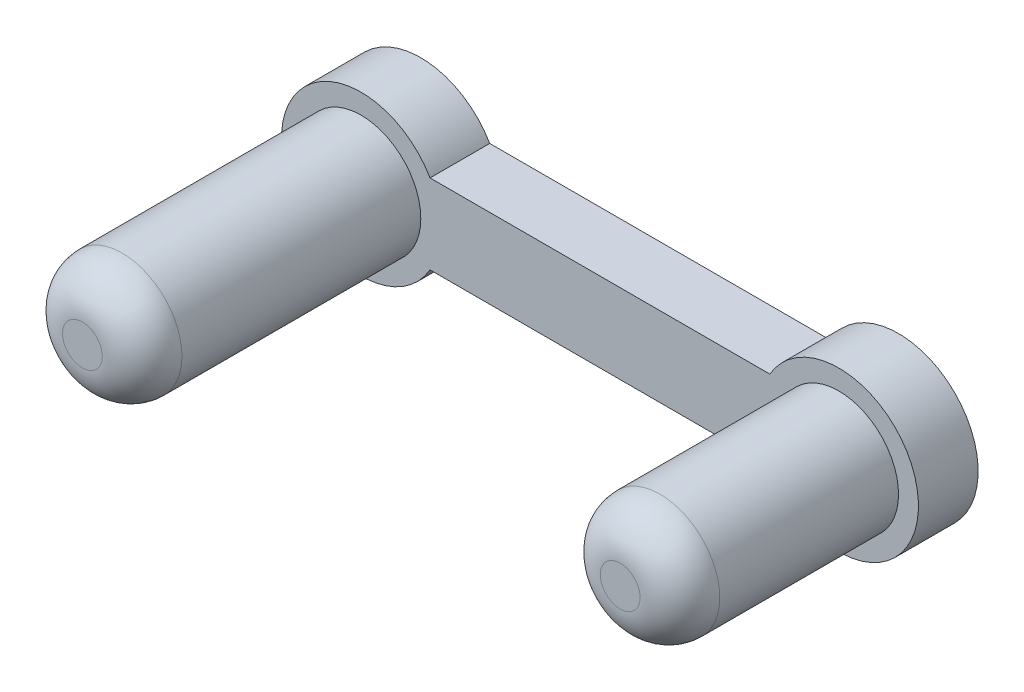
ISO-10303-21;
HEADER;
FILE_DESCRIPTION(('STEP AP214'),'2;1');
FILE_NAME('part.step','',(''),(''),'','','');
FILE_SCHEMA(('AUTOMOTIVE_DESIGN { 1 0 10303 214 1 1 1 1 }'));
ENDSEC;
DATA;
#1=APPLICATION_CONTEXT('core data for automotive mechanical design processes');
#2=APPLICATION_PROTOCOL_DEFINITION('international standard','automotive_design',2000,#1);
#3=PRODUCT_CONTEXT('',#1,'mechanical');
#4=PRODUCT('Part','Part','',(#3));
#5=PRODUCT_RELATED_PRODUCT_CATEGORY('part','',(#4));
#6=PRODUCT_DEFINITION_FORMATION('','',#4);
#7=PRODUCT_DEFINITION_CONTEXT('part definition',#1,'design');
#8=PRODUCT_DEFINITION('design','',#6,#7);
#9=PRODUCT_DEFINITION_SHAPE('','',#8);
#10=(LENGTH_UNIT() NAMED_UNIT(*) SI_UNIT(.MILLI.,.METRE.));
#11=(NAMED_UNIT(*) PLANE_ANGLE_UNIT() SI_UNIT($,.RADIAN.));
#12=(NAMED_UNIT(*) SI_UNIT($,.STERADIAN.) SOLID_ANGLE_UNIT());
#13=UNCERTAINTY_MEASURE_WITH_UNIT(LENGTH_MEASURE(1.E-05),#10,'distance_accuracy_value','');
#14=(GEOMETRIC_REPRESENTATION_CONTEXT(3) GLOBAL_UNCERTAINTY_ASSIGNED_CONTEXT((#13)) GLOBAL_UNIT_ASSIGNED_CONTEXT((#10,
#11,#12)) REPRESENTATION_CONTEXT('',''));
#15=CARTESIAN_POINT('',(0.,0.,0.));
#16=DIRECTION('',(0.,0.,1.));
#17=DIRECTION('',(1.,0.,0.));
#18=AXIS2_PLACEMENT_3D('',#15,#16,#17);
#19=CARTESIAN_POINT('',(60.,-40.,-31.6227766016838));
#20=DIRECTION('',(0.,1.,0.));
#21=DIRECTION('',(0.,0.,1.));
#22=AXIS2_PLACEMENT_3D('',#19,#20,#21);
#23=PLANE('',#22);
#24=DIRECTION('',(-1.,0.,0.));
#25=VECTOR('',#24,1.);
#26=CARTESIAN_POINT('',(60.,-40.,7.5));
#27=LINE('',#26,#25);
#28=CARTESIAN_POINT('',(96.3397459621556,-40.,7.5));
#29=VERTEX_POINT('',#28);
#30=CARTESIAN_POINT('',(53.6602540378444,-40.,7.5));
#31=VERTEX_POINT('',#30);
#32=EDGE_CURVE('E239',#29,#31,#27,.T.);
#33=ORIENTED_EDGE('',*,*,#32,.F.);
#34=DIRECTION('',(0.,0.,1.));
#35=VECTOR('',#34,1.);
#36=CARTESIAN_POINT('',(96.3397459621556,-40.,0.));
#37=LINE('',#36,#35);
#38=CARTESIAN_POINT('',(96.3397459621556,-40.,0.));
#39=VERTEX_POINT('',#38);
#40=EDGE_CURVE('E263',#39,#29,#37,.T.);
#41=ORIENTED_EDGE('',*,*,#40,.F.);
#42=DIRECTION('',(1.,0.,0.));
#43=VECTOR('',#42,1.);
#44=CARTESIAN_POINT('',(60.,-40.,0.));
#45=LINE('',#44,#43);
#46=CARTESIAN_POINT('',(53.6602540378444,-40.,0.));
#47=VERTEX_POINT('',#46);
#48=EDGE_CURVE('E259',#47,#39,#45,.T.);
#49=ORIENTED_EDGE('',*,*,#48,.F.);
#50=DIRECTION('',(0.,0.,1.));
#51=VECTOR('',#50,1.);
#52=CARTESIAN_POINT('',(53.6602540378444,-40.,0.));
#53=LINE('',#52,#51);
#54=EDGE_CURVE('E261',#47,#31,#53,.T.);
#55=ORIENTED_EDGE('',*,*,#54,.T.);
#56=EDGE_LOOP('',(#33,#41,#49,#55));
#57=FACE_BOUND('',#56,.T.);
#58=ADVANCED_FACE('F215',(#57),#23,.T.);
#59=CARTESIAN_POINT('',(60.,-50.,-31.6227766016838));
#60=DIRECTION('',(0.,-1.,0.));
#61=DIRECTION('',(0.,0.,-1.));
#62=AXIS2_PLACEMENT_3D('',#59,#60,#61);
#63=PLANE('',#62);
#64=DIRECTION('',(-1.,0.,0.));
#65=VECTOR('',#64,1.);
#66=CARTESIAN_POINT('',(60.,-50.,0.));
#67=LINE('',#66,#65);
#68=CARTESIAN_POINT('',(96.3397459621556,-50.,0.));
#69=VERTEX_POINT('',#68);
#70=CARTESIAN_POINT('',(53.6602540378444,-50.,0.));
#71=VERTEX_POINT('',#70);
#72=EDGE_CURVE('E269',#69,#71,#67,.T.);
#73=ORIENTED_EDGE('',*,*,#72,.F.);
#74=DIRECTION('',(0.,0.,1.));
#75=VECTOR('',#74,1.);
#76=CARTESIAN_POINT('',(96.3397459621556,-50.,0.));
#77=LINE('',#76,#75);
#78=CARTESIAN_POINT('',(96.3397459621556,-50.,7.5));
#79=VERTEX_POINT('',#78);
#80=EDGE_CURVE('E282',#69,#79,#77,.T.);
#81=ORIENTED_EDGE('',*,*,#80,.T.);
#82=DIRECTION('',(1.,0.,0.));
#83=VECTOR('',#82,1.);
#84=CARTESIAN_POINT('',(60.,-50.,7.5));
#85=LINE('',#84,#83);
#86=CARTESIAN_POINT('',(53.6602540378444,-50.,7.5));
#87=VERTEX_POINT('',#86);
#88=EDGE_CURVE('E231',#87,#79,#85,.T.);
#89=ORIENTED_EDGE('',*,*,#88,.F.);
#90=DIRECTION('',(0.,0.,1.));
#91=VECTOR('',#90,1.);
#92=CARTESIAN_POINT('',(53.6602540378444,-50.,0.));
#93=LINE('',#92,#91);
#94=EDGE_CURVE('E277',#71,#87,#93,.T.);
#95=ORIENTED_EDGE('',*,*,#94,.F.);
#96=EDGE_LOOP('',(#73,#81,#89,#95));
#97=FACE_BOUND('',#96,.T.);
#98=ADVANCED_FACE('F329',(#97),#63,.T.);
#99=CARTESIAN_POINT('',(0.,0.,7.5));
#100=DIRECTION('',(0.,0.,1.));
#101=DIRECTION('',(1.,0.,0.));
#102=AXIS2_PLACEMENT_3D('',#99,#100,#101);
#103=PLANE('',#102);
#104=CARTESIAN_POINT('',(45.,-45.,7.5));
#105=DIRECTION('',(0.,0.,1.));
#106=DIRECTION('',(1.,0.,0.));
#107=AXIS2_PLACEMENT_3D('',#104,#105,#106);
#108=CIRCLE('',#107,10.);
#109=EDGE_CURVE('E275',#31,#87,#108,.T.);
#110=ORIENTED_EDGE('',*,*,#109,.T.);
#111=ORIENTED_EDGE('',*,*,#88,.T.);
#112=CARTESIAN_POINT('',(105.,-45.,7.5));
#113=DIRECTION('',(0.,0.,1.));
#114=DIRECTION('',(1.,0.,0.));
#115=AXIS2_PLACEMENT_3D('',#112,#113,#114);
#116=CIRCLE('',#115,9.99999999999999);
#117=EDGE_CURVE('E286',#79,#29,#116,.T.);
#118=ORIENTED_EDGE('',*,*,#117,.T.);
#119=ORIENTED_EDGE('',*,*,#32,.T.);
#120=EDGE_LOOP('',(#110,#111,#118,#119));
#121=FACE_BOUND('',#120,.T.);
#122=CARTESIAN_POINT('',(45.,-45.,7.5));
#123=DIRECTION('',(0.,0.,1.));
#124=DIRECTION('',(1.,0.,0.));
#125=AXIS2_PLACEMENT_3D('',#122,#123,#124);
#126=CIRCLE('',#125,7.5);
#127=CARTESIAN_POINT('',(52.5,-45.,7.5));
#128=VERTEX_POINT('',#127);
#129=EDGE_CURVE('E219',#128,#128,#126,.T.);
#130=ORIENTED_EDGE('',*,*,#129,.F.);
#131=EDGE_LOOP('',(#130));
#132=FACE_BOUND('',#131,.T.);
#133=CARTESIAN_POINT('',(105.,-45.,7.5));
#134=DIRECTION('',(0.,0.,1.));
#135=DIRECTION('',(1.,0.,0.));
#136=AXIS2_PLACEMENT_3D('',#133,#134,#135);
#137=CIRCLE('',#136,7.50000000000001);
#138=CARTESIAN_POINT('',(112.5,-45.,7.5));
#139=VERTEX_POINT('',#138);
#140=EDGE_CURVE('E297',#139,#139,#137,.T.);
#141=ORIENTED_EDGE('',*,*,#140,.F.);
#142=EDGE_LOOP('',(#141));
#143=FACE_BOUND('',#142,.T.);
#144=ADVANCED_FACE('F326',(#121,#132,#143),#103,.T.);
#145=CARTESIAN_POINT('',(45.,-45.,42.5));
#146=DIRECTION('',(0.,0.,-1.));
#147=DIRECTION('',(-1.,0.,0.));
#148=AXIS2_PLACEMENT_3D('',#145,#146,#147);
#149=CYLINDRICAL_SURFACE('',#148,7.5);
#150=CARTESIAN_POINT('',(45.,-45.,37.5));
#151=DIRECTION('',(0.,0.,1.));
#152=DIRECTION('',(1.,0.,0.));
#153=AXIS2_PLACEMENT_3D('',#150,#151,#152);
#154=CIRCLE('',#153,7.5);
#155=CARTESIAN_POINT('',(52.5,-45.,37.5));
#156=VERTEX_POINT('',#155);
#157=EDGE_CURVE('E315',#156,#156,#154,.F.);
#158=ORIENTED_EDGE('',*,*,#157,.T.);
#159=EDGE_LOOP('',(#158));
#160=FACE_BOUND('',#159,.T.);
#161=ORIENTED_EDGE('',*,*,#129,.T.);
#162=EDGE_LOOP('',(#161));
#163=FACE_BOUND('',#162,.T.);
#164=ADVANCED_FACE('F324',(#160,#163),#149,.T.);
#165=CARTESIAN_POINT('',(0.,0.,42.5));
#166=DIRECTION('',(0.,0.,1.));
#167=DIRECTION('',(1.,0.,0.));
#168=AXIS2_PLACEMENT_3D('',#165,#166,#167);
#169=PLANE('',#168);
#170=CARTESIAN_POINT('',(45.,-45.,42.5));
#171=DIRECTION('',(0.,0.,1.));
#172=DIRECTION('',(1.,0.,0.));
#173=AXIS2_PLACEMENT_3D('',#170,#171,#172);
#174=CIRCLE('',#173,2.5);
#175=CARTESIAN_POINT('',(47.5,-45.,42.5));
#176=VERTEX_POINT('',#175);
#177=EDGE_CURVE('E12',#176,#176,#174,.T.);
#178=ORIENTED_EDGE('',*,*,#177,.T.);
#179=EDGE_LOOP('',(#178));
#180=FACE_BOUND('',#179,.T.);
#181=ADVANCED_FACE('F358',(#180),#169,.T.);
#182=CARTESIAN_POINT('',(45.,-45.,37.5));
#183=DIRECTION('',(0.,0.,1.));
#184=DIRECTION('',(1.,0.,0.));
#185=AXIS2_PLACEMENT_3D('',#182,#183,#184);
#186=DEGENERATE_TOROIDAL_SURFACE('',#185,2.5,5.,.T.);
#187=ORIENTED_EDGE('',*,*,#157,.F.);
#188=EDGE_LOOP('',(#187));
#189=FACE_BOUND('',#188,.T.);
#190=ORIENTED_EDGE('',*,*,#177,.F.);
#191=EDGE_LOOP('',(#190));
#192=FACE_BOUND('',#191,.T.);
#193=ADVANCED_FACE('F356',(#189,#192),#186,.T.);
#194=CARTESIAN_POINT('',(0.,0.,0.));
#195=DIRECTION('',(0.,0.,1.));
#196=DIRECTION('',(1.,0.,0.));
#197=AXIS2_PLACEMENT_3D('',#194,#195,#196);
#198=PLANE('',#197);
#199=ORIENTED_EDGE('',*,*,#72,.T.);
#200=CARTESIAN_POINT('',(45.,-45.,0.));
#201=DIRECTION('',(0.,0.,1.));
#202=DIRECTION('',(1.,0.,0.));
#203=AXIS2_PLACEMENT_3D('',#200,#201,#202);
#204=CIRCLE('',#203,10.);
#205=EDGE_CURVE('E274',#47,#71,#204,.T.);
#206=ORIENTED_EDGE('',*,*,#205,.F.);
#207=ORIENTED_EDGE('',*,*,#48,.T.);
#208=CARTESIAN_POINT('',(105.,-45.,0.));
#209=DIRECTION('',(0.,0.,1.));
#210=DIRECTION('',(1.,0.,0.));
#211=AXIS2_PLACEMENT_3D('',#208,#209,#210);
#212=CIRCLE('',#211,9.99999999999999);
#213=EDGE_CURVE('E288',#69,#39,#212,.T.);
#214=ORIENTED_EDGE('',*,*,#213,.F.);
#215=EDGE_LOOP('',(#199,#206,#207,#214));
#216=FACE_BOUND('',#215,.T.);
#217=ADVANCED_FACE('F217',(#216),#198,.F.);
#218=CARTESIAN_POINT('',(0.,0.,34.9544342685657));
#219=DIRECTION('',(0.,0.,1.));
#220=DIRECTION('',(1.,0.,0.));
#221=AXIS2_PLACEMENT_3D('',#218,#219,#220);
#222=PLANE('',#221);
#223=CARTESIAN_POINT('',(105.,-45.,34.9544342685657));
#224=DIRECTION('',(0.,0.,1.));
#225=DIRECTION('',(1.,0.,0.));
#226=AXIS2_PLACEMENT_3D('',#223,#224,#225);
#227=CIRCLE('',#226,2.50000000000001);
#228=CARTESIAN_POINT('',(107.5,-45.,34.9544342685657));
#229=VERTEX_POINT('',#228);
#230=EDGE_CURVE('E301',#229,#229,#227,.T.);
#231=ORIENTED_EDGE('',*,*,#230,.T.);
#232=EDGE_LOOP('',(#231));
#233=FACE_BOUND('',#232,.T.);
#234=ADVANCED_FACE('F346',(#233),#222,.T.);
#235=CARTESIAN_POINT('',(105.,-45.,29.9544342685657));
#236=DIRECTION('',(0.,0.,1.));
#237=DIRECTION('',(1.,0.,0.));
#238=AXIS2_PLACEMENT_3D('',#235,#236,#237);
#239=DEGENERATE_TOROIDAL_SURFACE('',#238,2.50000000000001,5.,.T.);
#240=CARTESIAN_POINT('',(105.,-45.,29.9544342685657));
#241=DIRECTION('',(0.,0.,1.));
#242=DIRECTION('',(1.,0.,0.));
#243=AXIS2_PLACEMENT_3D('',#240,#241,#242);
#244=CIRCLE('',#243,7.50000000000001);
#245=CARTESIAN_POINT('',(112.5,-45.,29.9544342685657));
#246=VERTEX_POINT('',#245);
#247=EDGE_CURVE('E305',#246,#246,#244,.F.);
#248=ORIENTED_EDGE('',*,*,#247,.F.);
#249=EDGE_LOOP('',(#248));
#250=FACE_BOUND('',#249,.T.);
#251=ORIENTED_EDGE('',*,*,#230,.F.);
#252=EDGE_LOOP('',(#251));
#253=FACE_BOUND('',#252,.T.);
#254=ADVANCED_FACE('F336',(#250,#253),#239,.T.);
#255=CARTESIAN_POINT('',(105.,-45.,42.5));
#256=DIRECTION('',(0.,0.,-1.));
#257=DIRECTION('',(-1.,0.,0.));
#258=AXIS2_PLACEMENT_3D('',#255,#256,#257);
#259=CYLINDRICAL_SURFACE('',#258,7.50000000000001);
#260=ORIENTED_EDGE('',*,*,#247,.T.);
#261=EDGE_LOOP('',(#260));
#262=FACE_BOUND('',#261,.T.);
#263=ORIENTED_EDGE('',*,*,#140,.T.);
#264=EDGE_LOOP('',(#263));
#265=FACE_BOUND('',#264,.T.);
#266=ADVANCED_FACE('F333',(#262,#265),#259,.T.);
#267=CARTESIAN_POINT('',(105.,-45.,0.));
#268=DIRECTION('',(0.,0.,1.));
#269=DIRECTION('',(1.,0.,0.));
#270=AXIS2_PLACEMENT_3D('',#267,#268,#269);
#271=CYLINDRICAL_SURFACE('',#270,9.99999999999999);
#272=ORIENTED_EDGE('',*,*,#80,.F.);
#273=ORIENTED_EDGE('',*,*,#213,.T.);
#274=ORIENTED_EDGE('',*,*,#40,.T.);
#275=ORIENTED_EDGE('',*,*,#117,.F.);
#276=EDGE_LOOP('',(#272,#273,#274,#275));
#277=FACE_BOUND('',#276,.T.);
#278=ADVANCED_FACE('F335',(#277),#271,.T.);
#279=CARTESIAN_POINT('',(45.,-45.,0.));
#280=DIRECTION('',(0.,0.,1.));
#281=DIRECTION('',(1.,0.,0.));
#282=AXIS2_PLACEMENT_3D('',#279,#280,#281);
#283=CYLINDRICAL_SURFACE('',#282,10.);
#284=ORIENTED_EDGE('',*,*,#54,.F.);
#285=ORIENTED_EDGE('',*,*,#205,.T.);
#286=ORIENTED_EDGE('',*,*,#94,.T.);
#287=ORIENTED_EDGE('',*,*,#109,.F.);
#288=EDGE_LOOP('',(#284,#285,#286,#287));
#289=FACE_BOUND('',#288,.T.);
#290=ADVANCED_FACE('F273',(#289),#283,.T.);
#291=CLOSED_SHELL('',(#58,#98,#144,#164,#181,#193,#217,#234,#254,#266,#278,#290));
#292=MANIFOLD_SOLID_BREP('B2',#291);
#293=ADVANCED_BREP_SHAPE_REPRESENTATION('',(#18,#292),#14);
#294=SHAPE_DEFINITION_REPRESENTATION(#9,#293);
ENDSEC;
END-ISO-10303-21;
